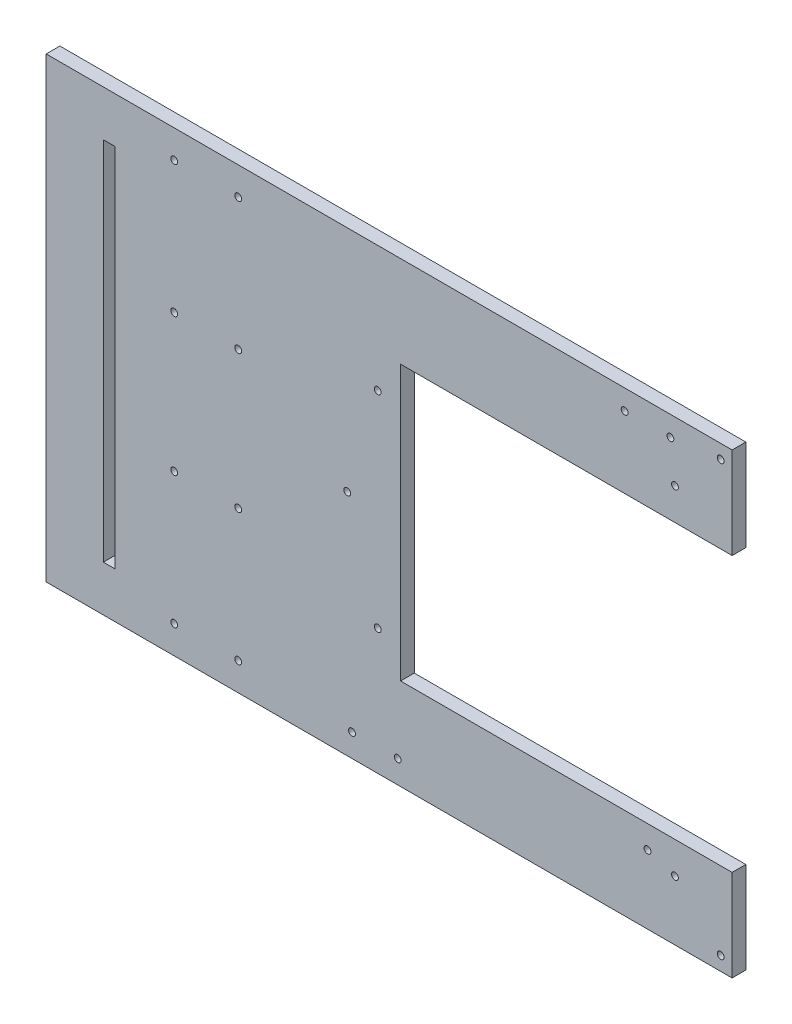
ISO-10303-21;
HEADER;
FILE_DESCRIPTION(('STEP AP214'),'2;1');
FILE_NAME('part.step','',(''),(''),'','','');
FILE_SCHEMA(('AUTOMOTIVE_DESIGN { 1 0 10303 214 1 1 1 1 }'));
ENDSEC;
DATA;
#1=APPLICATION_CONTEXT('core data for automotive mechanical design processes');
#2=APPLICATION_PROTOCOL_DEFINITION('international standard','automotive_design',2000,#1);
#3=PRODUCT_CONTEXT('',#1,'mechanical');
#4=PRODUCT('Part','Part','',(#3));
#5=PRODUCT_RELATED_PRODUCT_CATEGORY('part','',(#4));
#6=PRODUCT_DEFINITION_FORMATION('','',#4);
#7=PRODUCT_DEFINITION_CONTEXT('part definition',#1,'design');
#8=PRODUCT_DEFINITION('design','',#6,#7);
#9=PRODUCT_DEFINITION_SHAPE('','',#8);
#10=(LENGTH_UNIT() NAMED_UNIT(*) SI_UNIT(.MILLI.,.METRE.));
#11=(NAMED_UNIT(*) PLANE_ANGLE_UNIT() SI_UNIT($,.RADIAN.));
#12=(NAMED_UNIT(*) SI_UNIT($,.STERADIAN.) SOLID_ANGLE_UNIT());
#13=UNCERTAINTY_MEASURE_WITH_UNIT(LENGTH_MEASURE(1.E-05),#10,'distance_accuracy_value','');
#14=(GEOMETRIC_REPRESENTATION_CONTEXT(3) GLOBAL_UNCERTAINTY_ASSIGNED_CONTEXT((#13)) GLOBAL_UNIT_ASSIGNED_CONTEXT((#10,
#11,#12)) REPRESENTATION_CONTEXT('',''));
#15=CARTESIAN_POINT('',(0.,0.,0.));
#16=DIRECTION('',(0.,0.,1.));
#17=DIRECTION('',(1.,0.,0.));
#18=AXIS2_PLACEMENT_3D('',#15,#16,#17);
#19=CARTESIAN_POINT('',(0.,0.,6.));
#20=DIRECTION('',(0.,0.,-1.));
#21=DIRECTION('',(-1.,0.,0.));
#22=AXIS2_PLACEMENT_3D('',#19,#20,#21);
#23=PLANE('',#22);
#24=CARTESIAN_POINT('',(262.999999999935,29.9999999999989,6.00000000000001));
#25=DIRECTION('',(0.,0.,1.));
#26=DIRECTION('',(1.,0.,0.));
#27=AXIS2_PLACEMENT_3D('',#24,#25,#26);
#28=CIRCLE('',#27,1.5);
#29=CARTESIAN_POINT('',(264.499999999935,29.9999999999989,6.00000000000001));
#30=VERTEX_POINT('',#29);
#31=EDGE_CURVE('E627',#30,#30,#28,.T.);
#32=ORIENTED_EDGE('',*,*,#31,.F.);
#33=EDGE_LOOP('',(#32));
#34=FACE_BOUND('',#33,.T.);
#35=CARTESIAN_POINT('',(145.,54.9999999999977,6.00000000000001));
#36=DIRECTION('',(0.,0.,1.));
#37=DIRECTION('',(1.,0.,0.));
#38=AXIS2_PLACEMENT_3D('',#35,#36,#37);
#39=CIRCLE('',#38,1.5);
#40=CARTESIAN_POINT('',(146.5,54.9999999999977,6.00000000000001));
#41=VERTEX_POINT('',#40);
#42=EDGE_CURVE('E621',#41,#41,#39,.T.);
#43=ORIENTED_EDGE('',*,*,#42,.F.);
#44=EDGE_LOOP('',(#43));
#45=FACE_BOUND('',#44,.T.);
#46=CARTESIAN_POINT('',(145.,144.999999999998,6.00000000000001));
#47=DIRECTION('',(0.,0.,1.));
#48=DIRECTION('',(1.,0.,0.));
#49=AXIS2_PLACEMENT_3D('',#46,#47,#48);
#50=CIRCLE('',#49,1.5);
#51=CARTESIAN_POINT('',(146.5,144.999999999998,6.00000000000001));
#52=VERTEX_POINT('',#51);
#53=EDGE_CURVE('E615',#52,#52,#50,.T.);
#54=ORIENTED_EDGE('',*,*,#53,.F.);
#55=EDGE_LOOP('',(#54));
#56=FACE_BOUND('',#55,.T.);
#57=CARTESIAN_POINT('',(131.667186687079,99.9999999999989,6.00000000000001));
#58=DIRECTION('',(0.,0.,1.));
#59=DIRECTION('',(1.,0.,0.));
#60=AXIS2_PLACEMENT_3D('',#57,#58,#59);
#61=CIRCLE('',#60,1.5);
#62=CARTESIAN_POINT('',(133.167186687079,99.9999999999989,6.00000000000001));
#63=VERTEX_POINT('',#62);
#64=EDGE_CURVE('E609',#63,#63,#61,.T.);
#65=ORIENTED_EDGE('',*,*,#64,.F.);
#66=EDGE_LOOP('',(#65));
#67=FACE_BOUND('',#66,.T.);
#68=CARTESIAN_POINT('',(252.999999999937,191.262292266871,6.00000000000001));
#69=DIRECTION('',(0.,0.,1.));
#70=DIRECTION('',(1.,0.,0.));
#71=AXIS2_PLACEMENT_3D('',#68,#69,#70);
#72=CIRCLE('',#71,1.5);
#73=CARTESIAN_POINT('',(254.499999999937,191.262292266871,6.00000000000001));
#74=VERTEX_POINT('',#73);
#75=EDGE_CURVE('E603',#74,#74,#72,.T.);
#76=ORIENTED_EDGE('',*,*,#75,.F.);
#77=EDGE_LOOP('',(#76));
#78=FACE_BOUND('',#77,.T.);
#79=CARTESIAN_POINT('',(272.999999999937,191.262292266871,6.00000000000001));
#80=DIRECTION('',(0.,0.,1.));
#81=DIRECTION('',(1.,0.,0.));
#82=AXIS2_PLACEMENT_3D('',#79,#80,#81);
#83=CIRCLE('',#82,1.5);
#84=CARTESIAN_POINT('',(274.499999999937,191.262292266871,6.00000000000001));
#85=VERTEX_POINT('',#84);
#86=EDGE_CURVE('E597',#85,#85,#83,.T.);
#87=ORIENTED_EDGE('',*,*,#86,.F.);
#88=EDGE_LOOP('',(#87));
#89=FACE_BOUND('',#88,.T.);
#90=CARTESIAN_POINT('',(294.999999999998,193.930972909708,6.00000000000001));
#91=DIRECTION('',(0.,0.,1.));
#92=DIRECTION('',(1.,0.,0.));
#93=AXIS2_PLACEMENT_3D('',#90,#91,#92);
#94=CIRCLE('',#93,1.5);
#95=CARTESIAN_POINT('',(296.499999999998,193.930972909708,6.00000000000001));
#96=VERTEX_POINT('',#95);
#97=EDGE_CURVE('E591',#96,#96,#94,.T.);
#98=ORIENTED_EDGE('',*,*,#97,.F.);
#99=EDGE_LOOP('',(#98));
#100=FACE_BOUND('',#99,.T.);
#101=CARTESIAN_POINT('',(274.999999999998,173.930972909708,6.00000000000001));
#102=DIRECTION('',(0.,0.,1.));
#103=DIRECTION('',(1.,0.,0.));
#104=AXIS2_PLACEMENT_3D('',#101,#102,#103);
#105=CIRCLE('',#104,1.5);
#106=CARTESIAN_POINT('',(276.499999999998,173.930972909708,6.00000000000001));
#107=VERTEX_POINT('',#106);
#108=EDGE_CURVE('E585',#107,#107,#105,.T.);
#109=ORIENTED_EDGE('',*,*,#108,.F.);
#110=EDGE_LOOP('',(#109));
#111=FACE_BOUND('',#110,.T.);
#112=CARTESIAN_POINT('',(294.999999999998,6.06902709029225,6.00000000000001));
#113=DIRECTION('',(0.,0.,1.));
#114=DIRECTION('',(1.,0.,0.));
#115=AXIS2_PLACEMENT_3D('',#112,#113,#114);
#116=CIRCLE('',#115,1.5);
#117=CARTESIAN_POINT('',(296.499999999998,6.06902709029225,6.00000000000001));
#118=VERTEX_POINT('',#117);
#119=EDGE_CURVE('E579',#118,#118,#116,.T.);
#120=ORIENTED_EDGE('',*,*,#119,.F.);
#121=EDGE_LOOP('',(#120));
#122=FACE_BOUND('',#121,.T.);
#123=CARTESIAN_POINT('',(274.999999999998,26.069027090292,6.00000000000001));
#124=DIRECTION('',(0.,0.,1.));
#125=DIRECTION('',(1.,0.,0.));
#126=AXIS2_PLACEMENT_3D('',#123,#124,#125);
#127=CIRCLE('',#126,1.5);
#128=CARTESIAN_POINT('',(276.499999999998,26.069027090292,6.00000000000001));
#129=VERTEX_POINT('',#128);
#130=EDGE_CURVE('E573',#129,#129,#127,.T.);
#131=ORIENTED_EDGE('',*,*,#130,.F.);
#132=EDGE_LOOP('',(#131));
#133=FACE_BOUND('',#132,.T.);
#134=CARTESIAN_POINT('',(133.760758533531,10.0000000000011,6.00000000000001));
#135=DIRECTION('',(0.,0.,1.));
#136=DIRECTION('',(1.,0.,0.));
#137=AXIS2_PLACEMENT_3D('',#134,#135,#136);
#138=CIRCLE('',#137,1.5);
#139=CARTESIAN_POINT('',(135.260758533531,10.0000000000011,6.00000000000001));
#140=VERTEX_POINT('',#139);
#141=EDGE_CURVE('E561',#140,#140,#138,.T.);
#142=ORIENTED_EDGE('',*,*,#141,.F.);
#143=EDGE_LOOP('',(#142));
#144=FACE_BOUND('',#143,.T.);
#145=CARTESIAN_POINT('',(84.0000000005229,69.9014541805839,6.00000000000001));
#146=DIRECTION('',(0.,0.,1.));
#147=DIRECTION('',(1.,0.,0.));
#148=AXIS2_PLACEMENT_3D('',#145,#146,#147);
#149=CIRCLE('',#148,1.49999999999999);
#150=CARTESIAN_POINT('',(85.5000000005229,69.9014541805839,6.00000000000001));
#151=VERTEX_POINT('',#150);
#152=EDGE_CURVE('E555',#151,#151,#149,.T.);
#153=ORIENTED_EDGE('',*,*,#152,.F.);
#154=EDGE_LOOP('',(#153));
#155=FACE_BOUND('',#154,.T.);
#156=CARTESIAN_POINT('',(56.0000000005229,69.9014541805842,6.00000000000001));
#157=DIRECTION('',(0.,0.,1.));
#158=DIRECTION('',(1.,0.,0.));
#159=AXIS2_PLACEMENT_3D('',#156,#157,#158);
#160=CIRCLE('',#159,1.49999999999999);
#161=CARTESIAN_POINT('',(57.5000000005229,69.9014541805842,6.00000000000001));
#162=VERTEX_POINT('',#161);
#163=EDGE_CURVE('E549',#162,#162,#160,.T.);
#164=ORIENTED_EDGE('',*,*,#163,.F.);
#165=EDGE_LOOP('',(#164));
#166=FACE_BOUND('',#165,.T.);
#167=CARTESIAN_POINT('',(84.0000000005223,12.2365999999972,6.00000000000001));
#168=DIRECTION('',(0.,0.,1.));
#169=DIRECTION('',(1.,0.,0.));
#170=AXIS2_PLACEMENT_3D('',#167,#168,#169);
#171=CIRCLE('',#170,1.49999999999999);
#172=CARTESIAN_POINT('',(85.5000000005223,12.2365999999972,6.00000000000001));
#173=VERTEX_POINT('',#172);
#174=EDGE_CURVE('E543',#173,#173,#171,.T.);
#175=ORIENTED_EDGE('',*,*,#174,.F.);
#176=EDGE_LOOP('',(#175));
#177=FACE_BOUND('',#176,.T.);
#178=CARTESIAN_POINT('',(56.0000000005223,12.2365999999975,6.00000000000001));
#179=DIRECTION('',(0.,0.,1.));
#180=DIRECTION('',(1.,0.,0.));
#181=AXIS2_PLACEMENT_3D('',#178,#179,#180);
#182=CIRCLE('',#181,1.49999999999999);
#183=CARTESIAN_POINT('',(57.5000000005223,12.2365999999975,6.00000000000001));
#184=VERTEX_POINT('',#183);
#185=EDGE_CURVE('E537',#184,#184,#182,.T.);
#186=ORIENTED_EDGE('',*,*,#185,.F.);
#187=EDGE_LOOP('',(#186));
#188=FACE_BOUND('',#187,.T.);
#189=CARTESIAN_POINT('',(84.000000000509,130.098545819415,6.00000000000001));
#190=DIRECTION('',(0.,0.,1.));
#191=DIRECTION('',(1.,0.,0.));
#192=AXIS2_PLACEMENT_3D('',#189,#190,#191);
#193=CIRCLE('',#192,1.49999999999999);
#194=CARTESIAN_POINT('',(85.500000000509,130.098545819415,6.00000000000001));
#195=VERTEX_POINT('',#194);
#196=EDGE_CURVE('E531',#195,#195,#193,.T.);
#197=ORIENTED_EDGE('',*,*,#196,.F.);
#198=EDGE_LOOP('',(#197));
#199=FACE_BOUND('',#198,.T.);
#200=CARTESIAN_POINT('',(56.000000000509,130.098545819415,6.00000000000001));
#201=DIRECTION('',(0.,0.,1.));
#202=DIRECTION('',(1.,0.,0.));
#203=AXIS2_PLACEMENT_3D('',#200,#201,#202);
#204=CIRCLE('',#203,1.49999999999999);
#205=CARTESIAN_POINT('',(57.500000000509,130.098545819415,6.00000000000001));
#206=VERTEX_POINT('',#205);
#207=EDGE_CURVE('E525',#206,#206,#204,.T.);
#208=ORIENTED_EDGE('',*,*,#207,.F.);
#209=EDGE_LOOP('',(#208));
#210=FACE_BOUND('',#209,.T.);
#211=CARTESIAN_POINT('',(84.0000000005085,187.763400000002,6.00000000000001));
#212=DIRECTION('',(0.,0.,1.));
#213=DIRECTION('',(1.,0.,0.));
#214=AXIS2_PLACEMENT_3D('',#211,#212,#213);
#215=CIRCLE('',#214,1.49999999999999);
#216=CARTESIAN_POINT('',(85.5000000005084,187.763400000002,6.00000000000001));
#217=VERTEX_POINT('',#216);
#218=EDGE_CURVE('E519',#217,#217,#215,.T.);
#219=ORIENTED_EDGE('',*,*,#218,.F.);
#220=EDGE_LOOP('',(#219));
#221=FACE_BOUND('',#220,.T.);
#222=CARTESIAN_POINT('',(56.0000000005084,187.763400000002,6.00000000000001));
#223=DIRECTION('',(0.,0.,1.));
#224=DIRECTION('',(1.,0.,0.));
#225=AXIS2_PLACEMENT_3D('',#222,#223,#224);
#226=CIRCLE('',#225,1.49999999999999);
#227=CARTESIAN_POINT('',(57.5000000005084,187.763400000002,6.00000000000001));
#228=VERTEX_POINT('',#227);
#229=EDGE_CURVE('E513',#228,#228,#226,.T.);
#230=ORIENTED_EDGE('',*,*,#229,.F.);
#231=EDGE_LOOP('',(#230));
#232=FACE_BOUND('',#231,.T.);
#233=DIRECTION('',(1.,0.,0.));
#234=VECTOR('',#233,1.);
#235=CARTESIAN_POINT('',(300.,160.,6.00000000000001));
#236=LINE('',#235,#234);
#237=CARTESIAN_POINT('',(155.,160.,6.00000000000001));
#238=VERTEX_POINT('',#237);
#239=CARTESIAN_POINT('',(300.,160.,6.00000000000001));
#240=VERTEX_POINT('',#239);
#241=EDGE_CURVE('E159',#238,#240,#236,.T.);
#242=ORIENTED_EDGE('',*,*,#241,.T.);
#243=DIRECTION('',(0.,1.,0.));
#244=VECTOR('',#243,1.);
#245=CARTESIAN_POINT('',(300.,0.,6.));
#246=LINE('',#245,#244);
#247=CARTESIAN_POINT('',(300.,200.,6.));
#248=VERTEX_POINT('',#247);
#249=EDGE_CURVE('E190',#240,#248,#246,.T.);
#250=ORIENTED_EDGE('',*,*,#249,.T.);
#251=DIRECTION('',(-1.,0.,0.));
#252=VECTOR('',#251,1.);
#253=CARTESIAN_POINT('',(0.,200.,6.));
#254=LINE('',#253,#252);
#255=CARTESIAN_POINT('',(0.,200.,6.));
#256=VERTEX_POINT('',#255);
#257=EDGE_CURVE('E194',#248,#256,#254,.T.);
#258=ORIENTED_EDGE('',*,*,#257,.T.);
#259=DIRECTION('',(0.,-1.,0.));
#260=VECTOR('',#259,1.);
#261=CARTESIAN_POINT('',(0.,0.,6.));
#262=LINE('',#261,#260);
#263=CARTESIAN_POINT('',(0.,0.,6.));
#264=VERTEX_POINT('',#263);
#265=EDGE_CURVE('E184',#256,#264,#262,.T.);
#266=ORIENTED_EDGE('',*,*,#265,.T.);
#267=DIRECTION('',(1.,0.,0.));
#268=VECTOR('',#267,1.);
#269=CARTESIAN_POINT('',(0.,0.,6.));
#270=LINE('',#269,#268);
#271=CARTESIAN_POINT('',(300.,0.,6.));
#272=VERTEX_POINT('',#271);
#273=EDGE_CURVE('E187',#264,#272,#270,.T.);
#274=ORIENTED_EDGE('',*,*,#273,.T.);
#275=CARTESIAN_POINT('',(300.,40.,6.00000000000001));
#276=VERTEX_POINT('',#275);
#277=EDGE_CURVE('E191',#272,#276,#246,.T.);
#278=ORIENTED_EDGE('',*,*,#277,.T.);
#279=DIRECTION('',(1.,0.,0.));
#280=VECTOR('',#279,1.);
#281=CARTESIAN_POINT('',(300.,40.,6.00000000000001));
#282=LINE('',#281,#280);
#283=CARTESIAN_POINT('',(155.,40.,6.00000000000001));
#284=VERTEX_POINT('',#283);
#285=EDGE_CURVE('E163',#284,#276,#282,.T.);
#286=ORIENTED_EDGE('',*,*,#285,.F.);
#287=DIRECTION('',(0.,1.,0.));
#288=VECTOR('',#287,1.);
#289=CARTESIAN_POINT('',(155.,160.,6.00000000000001));
#290=LINE('',#289,#288);
#291=EDGE_CURVE('E156',#284,#238,#290,.T.);
#292=ORIENTED_EDGE('',*,*,#291,.T.);
#293=EDGE_LOOP('',(#242,#250,#258,#266,#274,#278,#286,#292));
#294=FACE_BOUND('',#293,.T.);
#295=DIRECTION('',(1.,0.,0.));
#296=VECTOR('',#295,1.);
#297=CARTESIAN_POINT('',(25.,180.,6.00000000000001));
#298=LINE('',#297,#296);
#299=CARTESIAN_POINT('',(25.,180.,6.));
#300=VERTEX_POINT('',#299);
#301=CARTESIAN_POINT('',(30.,180.,6.00000000000001));
#302=VERTEX_POINT('',#301);
#303=EDGE_CURVE('E152',#300,#302,#298,.T.);
#304=ORIENTED_EDGE('',*,*,#303,.T.);
#305=DIRECTION('',(0.,-1.,0.));
#306=VECTOR('',#305,1.);
#307=CARTESIAN_POINT('',(30.,180.,6.00000000000001));
#308=LINE('',#307,#306);
#309=CARTESIAN_POINT('',(30.,20.,6.00000000000001));
#310=VERTEX_POINT('',#309);
#311=EDGE_CURVE('E155',#302,#310,#308,.T.);
#312=ORIENTED_EDGE('',*,*,#311,.T.);
#313=DIRECTION('',(-1.,0.,0.));
#314=VECTOR('',#313,1.);
#315=CARTESIAN_POINT('',(25.,20.,6.00000000000001));
#316=LINE('',#315,#314);
#317=CARTESIAN_POINT('',(25.,20.,6.00000000000001));
#318=VERTEX_POINT('',#317);
#319=EDGE_CURVE('E125',#310,#318,#316,.T.);
#320=ORIENTED_EDGE('',*,*,#319,.T.);
#321=DIRECTION('',(0.,1.,0.));
#322=VECTOR('',#321,1.);
#323=CARTESIAN_POINT('',(25.,180.,6.00000000000001));
#324=LINE('',#323,#322);
#325=EDGE_CURVE('E168',#318,#300,#324,.T.);
#326=ORIENTED_EDGE('',*,*,#325,.T.);
#327=EDGE_LOOP('',(#304,#312,#320,#326));
#328=FACE_BOUND('',#327,.T.);
#329=CARTESIAN_POINT('',(153.760758533531,10.0000000000013,6.00000000000001));
#330=DIRECTION('',(0.,0.,1.));
#331=DIRECTION('',(1.,0.,0.));
#332=AXIS2_PLACEMENT_3D('',#329,#330,#331);
#333=CIRCLE('',#332,1.5);
#334=CARTESIAN_POINT('',(155.260758533531,10.0000000000013,6.00000000000001));
#335=VERTEX_POINT('',#334);
#336=EDGE_CURVE('E567',#335,#335,#333,.T.);
#337=ORIENTED_EDGE('',*,*,#336,.F.);
#338=EDGE_LOOP('',(#337));
#339=FACE_BOUND('',#338,.T.);
#340=ADVANCED_FACE('F33',(#34,#45,#56,#67,#78,#89,#100,#111,#122,#133,#144,#155,#166,#177,#188,
#199,#210,#221,#232,#294,#328,#339),#23,.F.);
#341=CARTESIAN_POINT('',(0.,0.,0.));
#342=DIRECTION('',(0.,0.,-1.));
#343=DIRECTION('',(-1.,0.,0.));
#344=AXIS2_PLACEMENT_3D('',#341,#342,#343);
#345=PLANE('',#344);
#346=CARTESIAN_POINT('',(262.999999999935,29.9999999999989,0.));
#347=DIRECTION('',(0.,0.,1.));
#348=DIRECTION('',(1.,0.,0.));
#349=AXIS2_PLACEMENT_3D('',#346,#347,#348);
#350=CIRCLE('',#349,1.5);
#351=CARTESIAN_POINT('',(264.499999999935,29.9999999999989,0.));
#352=VERTEX_POINT('',#351);
#353=EDGE_CURVE('E624',#352,#352,#350,.T.);
#354=ORIENTED_EDGE('',*,*,#353,.T.);
#355=EDGE_LOOP('',(#354));
#356=FACE_BOUND('',#355,.T.);
#357=CARTESIAN_POINT('',(145.,54.9999999999977,0.));
#358=DIRECTION('',(0.,0.,1.));
#359=DIRECTION('',(1.,0.,0.));
#360=AXIS2_PLACEMENT_3D('',#357,#358,#359);
#361=CIRCLE('',#360,1.5);
#362=CARTESIAN_POINT('',(146.5,54.9999999999977,0.));
#363=VERTEX_POINT('',#362);
#364=EDGE_CURVE('E618',#363,#363,#361,.T.);
#365=ORIENTED_EDGE('',*,*,#364,.T.);
#366=EDGE_LOOP('',(#365));
#367=FACE_BOUND('',#366,.T.);
#368=CARTESIAN_POINT('',(145.,144.999999999998,0.));
#369=DIRECTION('',(0.,0.,1.));
#370=DIRECTION('',(1.,0.,0.));
#371=AXIS2_PLACEMENT_3D('',#368,#369,#370);
#372=CIRCLE('',#371,1.5);
#373=CARTESIAN_POINT('',(146.5,144.999999999998,0.));
#374=VERTEX_POINT('',#373);
#375=EDGE_CURVE('E612',#374,#374,#372,.T.);
#376=ORIENTED_EDGE('',*,*,#375,.T.);
#377=EDGE_LOOP('',(#376));
#378=FACE_BOUND('',#377,.T.);
#379=CARTESIAN_POINT('',(131.667186687079,99.9999999999989,0.));
#380=DIRECTION('',(0.,0.,1.));
#381=DIRECTION('',(1.,0.,0.));
#382=AXIS2_PLACEMENT_3D('',#379,#380,#381);
#383=CIRCLE('',#382,1.5);
#384=CARTESIAN_POINT('',(133.167186687079,99.9999999999989,0.));
#385=VERTEX_POINT('',#384);
#386=EDGE_CURVE('E606',#385,#385,#383,.T.);
#387=ORIENTED_EDGE('',*,*,#386,.T.);
#388=EDGE_LOOP('',(#387));
#389=FACE_BOUND('',#388,.T.);
#390=CARTESIAN_POINT('',(252.999999999937,191.262292266871,0.));
#391=DIRECTION('',(0.,0.,1.));
#392=DIRECTION('',(1.,0.,0.));
#393=AXIS2_PLACEMENT_3D('',#390,#391,#392);
#394=CIRCLE('',#393,1.5);
#395=CARTESIAN_POINT('',(254.499999999937,191.262292266871,0.));
#396=VERTEX_POINT('',#395);
#397=EDGE_CURVE('E600',#396,#396,#394,.T.);
#398=ORIENTED_EDGE('',*,*,#397,.T.);
#399=EDGE_LOOP('',(#398));
#400=FACE_BOUND('',#399,.T.);
#401=CARTESIAN_POINT('',(272.999999999937,191.262292266871,0.));
#402=DIRECTION('',(0.,0.,1.));
#403=DIRECTION('',(1.,0.,0.));
#404=AXIS2_PLACEMENT_3D('',#401,#402,#403);
#405=CIRCLE('',#404,1.5);
#406=CARTESIAN_POINT('',(274.499999999937,191.262292266871,0.));
#407=VERTEX_POINT('',#406);
#408=EDGE_CURVE('E594',#407,#407,#405,.T.);
#409=ORIENTED_EDGE('',*,*,#408,.T.);
#410=EDGE_LOOP('',(#409));
#411=FACE_BOUND('',#410,.T.);
#412=CARTESIAN_POINT('',(294.999999999998,193.930972909708,0.));
#413=DIRECTION('',(0.,0.,1.));
#414=DIRECTION('',(1.,0.,0.));
#415=AXIS2_PLACEMENT_3D('',#412,#413,#414);
#416=CIRCLE('',#415,1.5);
#417=CARTESIAN_POINT('',(296.499999999998,193.930972909708,0.));
#418=VERTEX_POINT('',#417);
#419=EDGE_CURVE('E588',#418,#418,#416,.T.);
#420=ORIENTED_EDGE('',*,*,#419,.T.);
#421=EDGE_LOOP('',(#420));
#422=FACE_BOUND('',#421,.T.);
#423=CARTESIAN_POINT('',(274.999999999998,173.930972909708,0.));
#424=DIRECTION('',(0.,0.,1.));
#425=DIRECTION('',(1.,0.,0.));
#426=AXIS2_PLACEMENT_3D('',#423,#424,#425);
#427=CIRCLE('',#426,1.5);
#428=CARTESIAN_POINT('',(276.499999999998,173.930972909708,0.));
#429=VERTEX_POINT('',#428);
#430=EDGE_CURVE('E582',#429,#429,#427,.T.);
#431=ORIENTED_EDGE('',*,*,#430,.T.);
#432=EDGE_LOOP('',(#431));
#433=FACE_BOUND('',#432,.T.);
#434=CARTESIAN_POINT('',(294.999999999998,6.06902709029225,0.));
#435=DIRECTION('',(0.,0.,1.));
#436=DIRECTION('',(1.,0.,0.));
#437=AXIS2_PLACEMENT_3D('',#434,#435,#436);
#438=CIRCLE('',#437,1.5);
#439=CARTESIAN_POINT('',(296.499999999998,6.06902709029225,0.));
#440=VERTEX_POINT('',#439);
#441=EDGE_CURVE('E576',#440,#440,#438,.T.);
#442=ORIENTED_EDGE('',*,*,#441,.T.);
#443=EDGE_LOOP('',(#442));
#444=FACE_BOUND('',#443,.T.);
#445=CARTESIAN_POINT('',(274.999999999998,26.069027090292,0.));
#446=DIRECTION('',(0.,0.,1.));
#447=DIRECTION('',(1.,0.,0.));
#448=AXIS2_PLACEMENT_3D('',#445,#446,#447);
#449=CIRCLE('',#448,1.5);
#450=CARTESIAN_POINT('',(276.499999999998,26.069027090292,0.));
#451=VERTEX_POINT('',#450);
#452=EDGE_CURVE('E570',#451,#451,#449,.T.);
#453=ORIENTED_EDGE('',*,*,#452,.T.);
#454=EDGE_LOOP('',(#453));
#455=FACE_BOUND('',#454,.T.);
#456=CARTESIAN_POINT('',(153.760758533531,10.0000000000013,0.));
#457=DIRECTION('',(0.,0.,1.));
#458=DIRECTION('',(1.,0.,0.));
#459=AXIS2_PLACEMENT_3D('',#456,#457,#458);
#460=CIRCLE('',#459,1.5);
#461=CARTESIAN_POINT('',(155.260758533531,10.0000000000013,0.));
#462=VERTEX_POINT('',#461);
#463=EDGE_CURVE('E564',#462,#462,#460,.T.);
#464=ORIENTED_EDGE('',*,*,#463,.T.);
#465=EDGE_LOOP('',(#464));
#466=FACE_BOUND('',#465,.T.);
#467=CARTESIAN_POINT('',(133.760758533531,10.0000000000011,0.));
#468=DIRECTION('',(0.,0.,1.));
#469=DIRECTION('',(1.,0.,0.));
#470=AXIS2_PLACEMENT_3D('',#467,#468,#469);
#471=CIRCLE('',#470,1.5);
#472=CARTESIAN_POINT('',(135.260758533531,10.0000000000011,0.));
#473=VERTEX_POINT('',#472);
#474=EDGE_CURVE('E558',#473,#473,#471,.T.);
#475=ORIENTED_EDGE('',*,*,#474,.T.);
#476=EDGE_LOOP('',(#475));
#477=FACE_BOUND('',#476,.T.);
#478=CARTESIAN_POINT('',(84.0000000005229,69.9014541805839,0.));
#479=DIRECTION('',(0.,0.,1.));
#480=DIRECTION('',(1.,0.,0.));
#481=AXIS2_PLACEMENT_3D('',#478,#479,#480);
#482=CIRCLE('',#481,1.5);
#483=CARTESIAN_POINT('',(85.5000000005229,69.9014541805839,0.));
#484=VERTEX_POINT('',#483);
#485=EDGE_CURVE('E552',#484,#484,#482,.T.);
#486=ORIENTED_EDGE('',*,*,#485,.T.);
#487=EDGE_LOOP('',(#486));
#488=FACE_BOUND('',#487,.T.);
#489=CARTESIAN_POINT('',(56.0000000005229,69.9014541805842,0.));
#490=DIRECTION('',(0.,0.,1.));
#491=DIRECTION('',(1.,0.,0.));
#492=AXIS2_PLACEMENT_3D('',#489,#490,#491);
#493=CIRCLE('',#492,1.5);
#494=CARTESIAN_POINT('',(57.5000000005229,69.9014541805842,0.));
#495=VERTEX_POINT('',#494);
#496=EDGE_CURVE('E546',#495,#495,#493,.T.);
#497=ORIENTED_EDGE('',*,*,#496,.T.);
#498=EDGE_LOOP('',(#497));
#499=FACE_BOUND('',#498,.T.);
#500=CARTESIAN_POINT('',(84.0000000005223,12.2365999999972,0.));
#501=DIRECTION('',(0.,0.,1.));
#502=DIRECTION('',(1.,0.,0.));
#503=AXIS2_PLACEMENT_3D('',#500,#501,#502);
#504=CIRCLE('',#503,1.5);
#505=CARTESIAN_POINT('',(85.5000000005223,12.2365999999972,0.));
#506=VERTEX_POINT('',#505);
#507=EDGE_CURVE('E540',#506,#506,#504,.T.);
#508=ORIENTED_EDGE('',*,*,#507,.T.);
#509=EDGE_LOOP('',(#508));
#510=FACE_BOUND('',#509,.T.);
#511=CARTESIAN_POINT('',(56.0000000005223,12.2365999999975,0.));
#512=DIRECTION('',(0.,0.,1.));
#513=DIRECTION('',(1.,0.,0.));
#514=AXIS2_PLACEMENT_3D('',#511,#512,#513);
#515=CIRCLE('',#514,1.5);
#516=CARTESIAN_POINT('',(57.5000000005223,12.2365999999975,0.));
#517=VERTEX_POINT('',#516);
#518=EDGE_CURVE('E534',#517,#517,#515,.T.);
#519=ORIENTED_EDGE('',*,*,#518,.T.);
#520=EDGE_LOOP('',(#519));
#521=FACE_BOUND('',#520,.T.);
#522=CARTESIAN_POINT('',(84.000000000509,130.098545819415,0.));
#523=DIRECTION('',(0.,0.,1.));
#524=DIRECTION('',(1.,0.,0.));
#525=AXIS2_PLACEMENT_3D('',#522,#523,#524);
#526=CIRCLE('',#525,1.5);
#527=CARTESIAN_POINT('',(85.500000000509,130.098545819415,0.));
#528=VERTEX_POINT('',#527);
#529=EDGE_CURVE('E528',#528,#528,#526,.T.);
#530=ORIENTED_EDGE('',*,*,#529,.T.);
#531=EDGE_LOOP('',(#530));
#532=FACE_BOUND('',#531,.T.);
#533=CARTESIAN_POINT('',(56.000000000509,130.098545819415,0.));
#534=DIRECTION('',(0.,0.,1.));
#535=DIRECTION('',(1.,0.,0.));
#536=AXIS2_PLACEMENT_3D('',#533,#534,#535);
#537=CIRCLE('',#536,1.5);
#538=CARTESIAN_POINT('',(57.500000000509,130.098545819415,0.));
#539=VERTEX_POINT('',#538);
#540=EDGE_CURVE('E522',#539,#539,#537,.T.);
#541=ORIENTED_EDGE('',*,*,#540,.T.);
#542=EDGE_LOOP('',(#541));
#543=FACE_BOUND('',#542,.T.);
#544=CARTESIAN_POINT('',(84.0000000005085,187.763400000002,0.));
#545=DIRECTION('',(0.,0.,1.));
#546=DIRECTION('',(1.,0.,0.));
#547=AXIS2_PLACEMENT_3D('',#544,#545,#546);
#548=CIRCLE('',#547,1.5);
#549=CARTESIAN_POINT('',(85.5000000005085,187.763400000002,0.));
#550=VERTEX_POINT('',#549);
#551=EDGE_CURVE('E516',#550,#550,#548,.T.);
#552=ORIENTED_EDGE('',*,*,#551,.T.);
#553=EDGE_LOOP('',(#552));
#554=FACE_BOUND('',#553,.T.);
#555=CARTESIAN_POINT('',(56.0000000005084,187.763400000002,0.));
#556=DIRECTION('',(0.,0.,1.));
#557=DIRECTION('',(1.,0.,0.));
#558=AXIS2_PLACEMENT_3D('',#555,#556,#557);
#559=CIRCLE('',#558,1.5);
#560=CARTESIAN_POINT('',(57.5000000005084,187.763400000002,0.));
#561=VERTEX_POINT('',#560);
#562=EDGE_CURVE('E144',#561,#561,#559,.T.);
#563=ORIENTED_EDGE('',*,*,#562,.T.);
#564=EDGE_LOOP('',(#563));
#565=FACE_BOUND('',#564,.T.);
#566=DIRECTION('',(0.,1.,0.));
#567=VECTOR('',#566,1.);
#568=CARTESIAN_POINT('',(300.,0.,0.));
#569=LINE('',#568,#567);
#570=CARTESIAN_POINT('',(300.,160.,0.));
#571=VERTEX_POINT('',#570);
#572=CARTESIAN_POINT('',(300.,200.,0.));
#573=VERTEX_POINT('',#572);
#574=EDGE_CURVE('E201',#571,#573,#569,.T.);
#575=ORIENTED_EDGE('',*,*,#574,.F.);
#576=DIRECTION('',(-1.,0.,0.));
#577=VECTOR('',#576,1.);
#578=CARTESIAN_POINT('',(300.,160.,0.));
#579=LINE('',#578,#577);
#580=CARTESIAN_POINT('',(155.,160.,0.));
#581=VERTEX_POINT('',#580);
#582=EDGE_CURVE('E171',#571,#581,#579,.T.);
#583=ORIENTED_EDGE('',*,*,#582,.T.);
#584=DIRECTION('',(0.,-1.,0.));
#585=VECTOR('',#584,1.);
#586=CARTESIAN_POINT('',(155.,160.,0.));
#587=LINE('',#586,#585);
#588=CARTESIAN_POINT('',(155.,40.,0.));
#589=VERTEX_POINT('',#588);
#590=EDGE_CURVE('E167',#581,#589,#587,.T.);
#591=ORIENTED_EDGE('',*,*,#590,.T.);
#592=DIRECTION('',(-1.,0.,0.));
#593=VECTOR('',#592,1.);
#594=CARTESIAN_POINT('',(300.,40.,0.));
#595=LINE('',#594,#593);
#596=CARTESIAN_POINT('',(300.,40.,0.));
#597=VERTEX_POINT('',#596);
#598=EDGE_CURVE('E164',#597,#589,#595,.T.);
#599=ORIENTED_EDGE('',*,*,#598,.F.);
#600=CARTESIAN_POINT('',(300.,0.,0.));
#601=VERTEX_POINT('',#600);
#602=EDGE_CURVE('E202',#601,#597,#569,.T.);
#603=ORIENTED_EDGE('',*,*,#602,.F.);
#604=DIRECTION('',(1.,0.,0.));
#605=VECTOR('',#604,1.);
#606=CARTESIAN_POINT('',(0.,0.,0.));
#607=LINE('',#606,#605);
#608=CARTESIAN_POINT('',(0.,0.,0.));
#609=VERTEX_POINT('',#608);
#610=EDGE_CURVE('E199',#609,#601,#607,.T.);
#611=ORIENTED_EDGE('',*,*,#610,.F.);
#612=DIRECTION('',(0.,-1.,0.));
#613=VECTOR('',#612,1.);
#614=CARTESIAN_POINT('',(0.,0.,0.));
#615=LINE('',#614,#613);
#616=CARTESIAN_POINT('',(0.,200.,0.));
#617=VERTEX_POINT('',#616);
#618=EDGE_CURVE('E183',#617,#609,#615,.T.);
#619=ORIENTED_EDGE('',*,*,#618,.F.);
#620=DIRECTION('',(-1.,0.,0.));
#621=VECTOR('',#620,1.);
#622=CARTESIAN_POINT('',(0.,200.,0.));
#623=LINE('',#622,#621);
#624=EDGE_CURVE('E188',#573,#617,#623,.T.);
#625=ORIENTED_EDGE('',*,*,#624,.F.);
#626=EDGE_LOOP('',(#575,#583,#591,#599,#603,#611,#619,#625));
#627=FACE_BOUND('',#626,.T.);
#628=DIRECTION('',(0.,1.,0.));
#629=VECTOR('',#628,1.);
#630=CARTESIAN_POINT('',(30.,180.,0.));
#631=LINE('',#630,#629);
#632=CARTESIAN_POINT('',(30.,20.,0.));
#633=VERTEX_POINT('',#632);
#634=CARTESIAN_POINT('',(30.,180.,0.));
#635=VERTEX_POINT('',#634);
#636=EDGE_CURVE('E132',#633,#635,#631,.T.);
#637=ORIENTED_EDGE('',*,*,#636,.T.);
#638=DIRECTION('',(-1.,0.,0.));
#639=VECTOR('',#638,1.);
#640=CARTESIAN_POINT('',(25.,180.,0.));
#641=LINE('',#640,#639);
#642=CARTESIAN_POINT('',(25.,180.,0.));
#643=VERTEX_POINT('',#642);
#644=EDGE_CURVE('E138',#635,#643,#641,.T.);
#645=ORIENTED_EDGE('',*,*,#644,.T.);
#646=DIRECTION('',(0.,-1.,0.));
#647=VECTOR('',#646,1.);
#648=CARTESIAN_POINT('',(25.,180.,0.));
#649=LINE('',#648,#647);
#650=CARTESIAN_POINT('',(25.,20.,0.));
#651=VERTEX_POINT('',#650);
#652=EDGE_CURVE('E142',#643,#651,#649,.T.);
#653=ORIENTED_EDGE('',*,*,#652,.T.);
#654=DIRECTION('',(1.,0.,0.));
#655=VECTOR('',#654,1.);
#656=CARTESIAN_POINT('',(25.,20.,0.));
#657=LINE('',#656,#655);
#658=EDGE_CURVE('E56',#651,#633,#657,.T.);
#659=ORIENTED_EDGE('',*,*,#658,.T.);
#660=EDGE_LOOP('',(#637,#645,#653,#659));
#661=FACE_BOUND('',#660,.T.);
#662=ADVANCED_FACE('F141',(#356,#367,#378,#389,#400,#411,#422,#433,#444,#455,#466,#477,#488,
#499,#510,#521,#532,#543,#554,#565,#627,#661),#345,.T.);
#663=CARTESIAN_POINT('',(300.,0.,6.));
#664=DIRECTION('',(-1.,0.,0.));
#665=DIRECTION('',(0.,0.,1.));
#666=AXIS2_PLACEMENT_3D('',#663,#664,#665);
#667=PLANE('',#666);
#668=DIRECTION('',(0.,0.,-1.));
#669=VECTOR('',#668,1.);
#670=CARTESIAN_POINT('',(300.,160.,194.215302247187));
#671=LINE('',#670,#669);
#672=EDGE_CURVE('E160',#240,#571,#671,.T.);
#673=ORIENTED_EDGE('',*,*,#672,.T.);
#674=ORIENTED_EDGE('',*,*,#574,.T.);
#675=DIRECTION('',(0.,0.,-1.));
#676=VECTOR('',#675,1.);
#677=CARTESIAN_POINT('',(300.,200.,6.));
#678=LINE('',#677,#676);
#679=EDGE_CURVE('E208',#248,#573,#678,.T.);
#680=ORIENTED_EDGE('',*,*,#679,.F.);
#681=ORIENTED_EDGE('',*,*,#249,.F.);
#682=EDGE_LOOP('',(#673,#674,#680,#681));
#683=FACE_BOUND('',#682,.T.);
#684=ADVANCED_FACE('F241',(#683),#667,.F.);
#685=CARTESIAN_POINT('',(0.,0.,6.));
#686=DIRECTION('',(1.,0.,0.));
#687=DIRECTION('',(0.,0.,-1.));
#688=AXIS2_PLACEMENT_3D('',#685,#686,#687);
#689=PLANE('',#688);
#690=ORIENTED_EDGE('',*,*,#618,.T.);
#691=DIRECTION('',(0.,0.,-1.));
#692=VECTOR('',#691,1.);
#693=CARTESIAN_POINT('',(0.,0.,6.));
#694=LINE('',#693,#692);
#695=EDGE_CURVE('E11',#264,#609,#694,.T.);
#696=ORIENTED_EDGE('',*,*,#695,.F.);
#697=ORIENTED_EDGE('',*,*,#265,.F.);
#698=DIRECTION('',(0.,0.,-1.));
#699=VECTOR('',#698,1.);
#700=CARTESIAN_POINT('',(0.,200.,6.));
#701=LINE('',#700,#699);
#702=EDGE_CURVE('E196',#256,#617,#701,.T.);
#703=ORIENTED_EDGE('',*,*,#702,.T.);
#704=EDGE_LOOP('',(#690,#696,#697,#703));
#705=FACE_BOUND('',#704,.T.);
#706=ADVANCED_FACE('F35',(#705),#689,.F.);
#707=CARTESIAN_POINT('',(0.,0.,6.));
#708=DIRECTION('',(0.,1.,0.));
#709=DIRECTION('',(0.,0.,1.));
#710=AXIS2_PLACEMENT_3D('',#707,#708,#709);
#711=PLANE('',#710);
#712=ORIENTED_EDGE('',*,*,#610,.T.);
#713=DIRECTION('',(0.,0.,-1.));
#714=VECTOR('',#713,1.);
#715=CARTESIAN_POINT('',(300.,0.,6.));
#716=LINE('',#715,#714);
#717=EDGE_CURVE('E41',#272,#601,#716,.T.);
#718=ORIENTED_EDGE('',*,*,#717,.F.);
#719=ORIENTED_EDGE('',*,*,#273,.F.);
#720=ORIENTED_EDGE('',*,*,#695,.T.);
#721=EDGE_LOOP('',(#712,#718,#719,#720));
#722=FACE_BOUND('',#721,.T.);
#723=ADVANCED_FACE('F231',(#722),#711,.F.);
#724=ORIENTED_EDGE('',*,*,#602,.T.);
#725=DIRECTION('',(0.,0.,-1.));
#726=VECTOR('',#725,1.);
#727=CARTESIAN_POINT('',(300.,40.,194.215302247187));
#728=LINE('',#727,#726);
#729=EDGE_CURVE('E174',#276,#597,#728,.T.);
#730=ORIENTED_EDGE('',*,*,#729,.F.);
#731=ORIENTED_EDGE('',*,*,#277,.F.);
#732=ORIENTED_EDGE('',*,*,#717,.T.);
#733=EDGE_LOOP('',(#724,#730,#731,#732));
#734=FACE_BOUND('',#733,.T.);
#735=ADVANCED_FACE('F215',(#734),#667,.F.);
#736=CARTESIAN_POINT('',(0.,200.,6.));
#737=DIRECTION('',(0.,-1.,0.));
#738=DIRECTION('',(0.,0.,-1.));
#739=AXIS2_PLACEMENT_3D('',#736,#737,#738);
#740=PLANE('',#739);
#741=ORIENTED_EDGE('',*,*,#624,.T.);
#742=ORIENTED_EDGE('',*,*,#702,.F.);
#743=ORIENTED_EDGE('',*,*,#257,.F.);
#744=ORIENTED_EDGE('',*,*,#679,.T.);
#745=EDGE_LOOP('',(#741,#742,#743,#744));
#746=FACE_BOUND('',#745,.T.);
#747=ADVANCED_FACE('F236',(#746),#740,.F.);
#748=CARTESIAN_POINT('',(300.,160.,194.215302247187));
#749=DIRECTION('',(0.,-1.,0.));
#750=DIRECTION('',(1.,0.,0.));
#751=AXIS2_PLACEMENT_3D('',#748,#749,#750);
#752=PLANE('',#751);
#753=DIRECTION('',(0.,0.,-1.));
#754=VECTOR('',#753,1.);
#755=CARTESIAN_POINT('',(155.,160.,194.215302247187));
#756=LINE('',#755,#754);
#757=EDGE_CURVE('E177',#238,#581,#756,.T.);
#758=ORIENTED_EDGE('',*,*,#757,.T.);
#759=ORIENTED_EDGE('',*,*,#582,.F.);
#760=ORIENTED_EDGE('',*,*,#672,.F.);
#761=ORIENTED_EDGE('',*,*,#241,.F.);
#762=EDGE_LOOP('',(#758,#759,#760,#761));
#763=FACE_BOUND('',#762,.T.);
#764=ADVANCED_FACE('F243',(#763),#752,.T.);
#765=CARTESIAN_POINT('',(155.,160.,194.215302247187));
#766=DIRECTION('',(1.,0.,0.));
#767=DIRECTION('',(0.,1.,0.));
#768=AXIS2_PLACEMENT_3D('',#765,#766,#767);
#769=PLANE('',#768);
#770=DIRECTION('',(0.,0.,-1.));
#771=VECTOR('',#770,1.);
#772=CARTESIAN_POINT('',(155.,40.,194.215302247187));
#773=LINE('',#772,#771);
#774=EDGE_CURVE('E179',#284,#589,#773,.T.);
#775=ORIENTED_EDGE('',*,*,#774,.T.);
#776=ORIENTED_EDGE('',*,*,#590,.F.);
#777=ORIENTED_EDGE('',*,*,#757,.F.);
#778=ORIENTED_EDGE('',*,*,#291,.F.);
#779=EDGE_LOOP('',(#775,#776,#777,#778));
#780=FACE_BOUND('',#779,.T.);
#781=ADVANCED_FACE('F246',(#780),#769,.T.);
#782=CARTESIAN_POINT('',(300.,40.,194.215302247187));
#783=DIRECTION('',(0.,-1.,0.));
#784=DIRECTION('',(1.,0.,0.));
#785=AXIS2_PLACEMENT_3D('',#782,#783,#784);
#786=PLANE('',#785);
#787=ORIENTED_EDGE('',*,*,#285,.T.);
#788=ORIENTED_EDGE('',*,*,#729,.T.);
#789=ORIENTED_EDGE('',*,*,#598,.T.);
#790=ORIENTED_EDGE('',*,*,#774,.F.);
#791=EDGE_LOOP('',(#787,#788,#789,#790));
#792=FACE_BOUND('',#791,.T.);
#793=ADVANCED_FACE('F225',(#792),#786,.F.);
#794=CARTESIAN_POINT('',(25.,180.,166.078105935821));
#795=DIRECTION('',(0.,-1.,0.));
#796=DIRECTION('',(0.,0.,-1.));
#797=AXIS2_PLACEMENT_3D('',#794,#795,#796);
#798=PLANE('',#797);
#799=DIRECTION('',(0.,0.,-1.));
#800=VECTOR('',#799,1.);
#801=CARTESIAN_POINT('',(25.,180.,166.078105935821));
#802=LINE('',#801,#800);
#803=EDGE_CURVE('E48',#300,#643,#802,.T.);
#804=ORIENTED_EDGE('',*,*,#803,.T.);
#805=ORIENTED_EDGE('',*,*,#644,.F.);
#806=DIRECTION('',(0.,0.,-1.));
#807=VECTOR('',#806,1.);
#808=CARTESIAN_POINT('',(30.,180.,166.078105935821));
#809=LINE('',#808,#807);
#810=EDGE_CURVE('E129',#302,#635,#809,.T.);
#811=ORIENTED_EDGE('',*,*,#810,.F.);
#812=ORIENTED_EDGE('',*,*,#303,.F.);
#813=EDGE_LOOP('',(#804,#805,#811,#812));
#814=FACE_BOUND('',#813,.T.);
#815=ADVANCED_FACE('F253',(#814),#798,.T.);
#816=CARTESIAN_POINT('',(30.,180.,166.078105935821));
#817=DIRECTION('',(-1.,0.,0.));
#818=DIRECTION('',(0.,-1.,0.));
#819=AXIS2_PLACEMENT_3D('',#816,#817,#818);
#820=PLANE('',#819);
#821=ORIENTED_EDGE('',*,*,#810,.T.);
#822=ORIENTED_EDGE('',*,*,#636,.F.);
#823=DIRECTION('',(0.,0.,-1.));
#824=VECTOR('',#823,1.);
#825=CARTESIAN_POINT('',(30.,20.,166.078105935821));
#826=LINE('',#825,#824);
#827=EDGE_CURVE('E121',#310,#633,#826,.T.);
#828=ORIENTED_EDGE('',*,*,#827,.F.);
#829=ORIENTED_EDGE('',*,*,#311,.F.);
#830=EDGE_LOOP('',(#821,#822,#828,#829));
#831=FACE_BOUND('',#830,.T.);
#832=ADVANCED_FACE('F133',(#831),#820,.T.);
#833=CARTESIAN_POINT('',(25.,20.,166.078105935821));
#834=DIRECTION('',(0.,1.,0.));
#835=DIRECTION('',(-1.,0.,0.));
#836=AXIS2_PLACEMENT_3D('',#833,#834,#835);
#837=PLANE('',#836);
#838=ORIENTED_EDGE('',*,*,#827,.T.);
#839=ORIENTED_EDGE('',*,*,#658,.F.);
#840=DIRECTION('',(0.,0.,-1.));
#841=VECTOR('',#840,1.);
#842=CARTESIAN_POINT('',(25.,20.,166.078105935821));
#843=LINE('',#842,#841);
#844=EDGE_CURVE('E128',#318,#651,#843,.T.);
#845=ORIENTED_EDGE('',*,*,#844,.F.);
#846=ORIENTED_EDGE('',*,*,#319,.F.);
#847=EDGE_LOOP('',(#838,#839,#845,#846));
#848=FACE_BOUND('',#847,.T.);
#849=ADVANCED_FACE('F123',(#848),#837,.T.);
#850=CARTESIAN_POINT('',(25.,180.,166.078105935821));
#851=DIRECTION('',(1.,0.,0.));
#852=DIRECTION('',(0.,1.,0.));
#853=AXIS2_PLACEMENT_3D('',#850,#851,#852);
#854=PLANE('',#853);
#855=ORIENTED_EDGE('',*,*,#844,.T.);
#856=ORIENTED_EDGE('',*,*,#652,.F.);
#857=ORIENTED_EDGE('',*,*,#803,.F.);
#858=ORIENTED_EDGE('',*,*,#325,.F.);
#859=EDGE_LOOP('',(#855,#856,#857,#858));
#860=FACE_BOUND('',#859,.T.);
#861=ADVANCED_FACE('F299',(#860),#854,.T.);
#862=CARTESIAN_POINT('',(56.0000000005084,187.763400000002,6.00000000000001));
#863=DIRECTION('',(0.,0.,1.));
#864=DIRECTION('',(1.,0.,0.));
#865=AXIS2_PLACEMENT_3D('',#862,#863,#864);
#866=CYLINDRICAL_SURFACE('',#865,1.49999999999999);
#867=ORIENTED_EDGE('',*,*,#562,.F.);
#868=EDGE_LOOP('',(#867));
#869=FACE_BOUND('',#868,.T.);
#870=ORIENTED_EDGE('',*,*,#229,.T.);
#871=EDGE_LOOP('',(#870));
#872=FACE_BOUND('',#871,.T.);
#873=ADVANCED_FACE('F293',(#869,#872),#866,.F.);
#874=CARTESIAN_POINT('',(84.0000000005085,187.763400000002,6.00000000000001));
#875=DIRECTION('',(0.,0.,1.));
#876=DIRECTION('',(1.,0.,0.));
#877=AXIS2_PLACEMENT_3D('',#874,#875,#876);
#878=CYLINDRICAL_SURFACE('',#877,1.49999999999999);
#879=ORIENTED_EDGE('',*,*,#551,.F.);
#880=EDGE_LOOP('',(#879));
#881=FACE_BOUND('',#880,.T.);
#882=ORIENTED_EDGE('',*,*,#218,.T.);
#883=EDGE_LOOP('',(#882));
#884=FACE_BOUND('',#883,.T.);
#885=ADVANCED_FACE('F298',(#881,#884),#878,.F.);
#886=CARTESIAN_POINT('',(56.000000000509,130.098545819415,6.00000000000001));
#887=DIRECTION('',(0.,0.,1.));
#888=DIRECTION('',(1.,0.,0.));
#889=AXIS2_PLACEMENT_3D('',#886,#887,#888);
#890=CYLINDRICAL_SURFACE('',#889,1.49999999999999);
#891=ORIENTED_EDGE('',*,*,#540,.F.);
#892=EDGE_LOOP('',(#891));
#893=FACE_BOUND('',#892,.T.);
#894=ORIENTED_EDGE('',*,*,#207,.T.);
#895=EDGE_LOOP('',(#894));
#896=FACE_BOUND('',#895,.T.);
#897=ADVANCED_FACE('F310',(#893,#896),#890,.F.);
#898=CARTESIAN_POINT('',(84.000000000509,130.098545819415,6.00000000000001));
#899=DIRECTION('',(0.,0.,1.));
#900=DIRECTION('',(1.,0.,0.));
#901=AXIS2_PLACEMENT_3D('',#898,#899,#900);
#902=CYLINDRICAL_SURFACE('',#901,1.49999999999999);
#903=ORIENTED_EDGE('',*,*,#529,.F.);
#904=EDGE_LOOP('',(#903));
#905=FACE_BOUND('',#904,.T.);
#906=ORIENTED_EDGE('',*,*,#196,.T.);
#907=EDGE_LOOP('',(#906));
#908=FACE_BOUND('',#907,.T.);
#909=ADVANCED_FACE('F320',(#905,#908),#902,.F.);
#910=CARTESIAN_POINT('',(56.0000000005223,12.2365999999975,6.00000000000001));
#911=DIRECTION('',(0.,0.,1.));
#912=DIRECTION('',(1.,0.,0.));
#913=AXIS2_PLACEMENT_3D('',#910,#911,#912);
#914=CYLINDRICAL_SURFACE('',#913,1.49999999999999);
#915=ORIENTED_EDGE('',*,*,#518,.F.);
#916=EDGE_LOOP('',(#915));
#917=FACE_BOUND('',#916,.T.);
#918=ORIENTED_EDGE('',*,*,#185,.T.);
#919=EDGE_LOOP('',(#918));
#920=FACE_BOUND('',#919,.T.);
#921=ADVANCED_FACE('F330',(#917,#920),#914,.F.);
#922=CARTESIAN_POINT('',(84.0000000005223,12.2365999999972,6.00000000000001));
#923=DIRECTION('',(0.,0.,1.));
#924=DIRECTION('',(1.,0.,0.));
#925=AXIS2_PLACEMENT_3D('',#922,#923,#924);
#926=CYLINDRICAL_SURFACE('',#925,1.49999999999999);
#927=ORIENTED_EDGE('',*,*,#507,.F.);
#928=EDGE_LOOP('',(#927));
#929=FACE_BOUND('',#928,.T.);
#930=ORIENTED_EDGE('',*,*,#174,.T.);
#931=EDGE_LOOP('',(#930));
#932=FACE_BOUND('',#931,.T.);
#933=ADVANCED_FACE('F340',(#929,#932),#926,.F.);
#934=CARTESIAN_POINT('',(56.0000000005229,69.9014541805842,6.00000000000001));
#935=DIRECTION('',(0.,0.,1.));
#936=DIRECTION('',(1.,0.,0.));
#937=AXIS2_PLACEMENT_3D('',#934,#935,#936);
#938=CYLINDRICAL_SURFACE('',#937,1.49999999999999);
#939=ORIENTED_EDGE('',*,*,#496,.F.);
#940=EDGE_LOOP('',(#939));
#941=FACE_BOUND('',#940,.T.);
#942=ORIENTED_EDGE('',*,*,#163,.T.);
#943=EDGE_LOOP('',(#942));
#944=FACE_BOUND('',#943,.T.);
#945=ADVANCED_FACE('F350',(#941,#944),#938,.F.);
#946=CARTESIAN_POINT('',(84.0000000005229,69.9014541805839,6.00000000000001));
#947=DIRECTION('',(0.,0.,1.));
#948=DIRECTION('',(1.,0.,0.));
#949=AXIS2_PLACEMENT_3D('',#946,#947,#948);
#950=CYLINDRICAL_SURFACE('',#949,1.49999999999999);
#951=ORIENTED_EDGE('',*,*,#485,.F.);
#952=EDGE_LOOP('',(#951));
#953=FACE_BOUND('',#952,.T.);
#954=ORIENTED_EDGE('',*,*,#152,.T.);
#955=EDGE_LOOP('',(#954));
#956=FACE_BOUND('',#955,.T.);
#957=ADVANCED_FACE('F360',(#953,#956),#950,.F.);
#958=CARTESIAN_POINT('',(133.760758533531,10.0000000000011,6.00000000000001));
#959=DIRECTION('',(0.,0.,1.));
#960=DIRECTION('',(1.,0.,0.));
#961=AXIS2_PLACEMENT_3D('',#958,#959,#960);
#962=CYLINDRICAL_SURFACE('',#961,1.5);
#963=ORIENTED_EDGE('',*,*,#474,.F.);
#964=EDGE_LOOP('',(#963));
#965=FACE_BOUND('',#964,.T.);
#966=ORIENTED_EDGE('',*,*,#141,.T.);
#967=EDGE_LOOP('',(#966));
#968=FACE_BOUND('',#967,.T.);
#969=ADVANCED_FACE('F370',(#965,#968),#962,.F.);
#970=CARTESIAN_POINT('',(153.760758533531,10.0000000000013,6.00000000000001));
#971=DIRECTION('',(0.,0.,1.));
#972=DIRECTION('',(1.,0.,0.));
#973=AXIS2_PLACEMENT_3D('',#970,#971,#972);
#974=CYLINDRICAL_SURFACE('',#973,1.5);
#975=ORIENTED_EDGE('',*,*,#463,.F.);
#976=EDGE_LOOP('',(#975));
#977=FACE_BOUND('',#976,.T.);
#978=ORIENTED_EDGE('',*,*,#336,.T.);
#979=EDGE_LOOP('',(#978));
#980=FACE_BOUND('',#979,.T.);
#981=ADVANCED_FACE('F380',(#977,#980),#974,.F.);
#982=CARTESIAN_POINT('',(274.999999999998,26.069027090292,6.00000000000001));
#983=DIRECTION('',(0.,0.,1.));
#984=DIRECTION('',(1.,0.,0.));
#985=AXIS2_PLACEMENT_3D('',#982,#983,#984);
#986=CYLINDRICAL_SURFACE('',#985,1.5);
#987=ORIENTED_EDGE('',*,*,#452,.F.);
#988=EDGE_LOOP('',(#987));
#989=FACE_BOUND('',#988,.T.);
#990=ORIENTED_EDGE('',*,*,#130,.T.);
#991=EDGE_LOOP('',(#990));
#992=FACE_BOUND('',#991,.T.);
#993=ADVANCED_FACE('F390',(#989,#992),#986,.F.);
#994=CARTESIAN_POINT('',(294.999999999998,6.06902709029225,6.00000000000001));
#995=DIRECTION('',(0.,0.,1.));
#996=DIRECTION('',(1.,0.,0.));
#997=AXIS2_PLACEMENT_3D('',#994,#995,#996);
#998=CYLINDRICAL_SURFACE('',#997,1.5);
#999=ORIENTED_EDGE('',*,*,#441,.F.);
#1000=EDGE_LOOP('',(#999));
#1001=FACE_BOUND('',#1000,.T.);
#1002=ORIENTED_EDGE('',*,*,#119,.T.);
#1003=EDGE_LOOP('',(#1002));
#1004=FACE_BOUND('',#1003,.T.);
#1005=ADVANCED_FACE('F400',(#1001,#1004),#998,.F.);
#1006=CARTESIAN_POINT('',(274.999999999998,173.930972909708,6.00000000000001));
#1007=DIRECTION('',(0.,0.,1.));
#1008=DIRECTION('',(1.,0.,0.));
#1009=AXIS2_PLACEMENT_3D('',#1006,#1007,#1008);
#1010=CYLINDRICAL_SURFACE('',#1009,1.5);
#1011=ORIENTED_EDGE('',*,*,#430,.F.);
#1012=EDGE_LOOP('',(#1011));
#1013=FACE_BOUND('',#1012,.T.);
#1014=ORIENTED_EDGE('',*,*,#108,.T.);
#1015=EDGE_LOOP('',(#1014));
#1016=FACE_BOUND('',#1015,.T.);
#1017=ADVANCED_FACE('F410',(#1013,#1016),#1010,.F.);
#1018=CARTESIAN_POINT('',(294.999999999998,193.930972909708,6.00000000000001));
#1019=DIRECTION('',(0.,0.,1.));
#1020=DIRECTION('',(1.,0.,0.));
#1021=AXIS2_PLACEMENT_3D('',#1018,#1019,#1020);
#1022=CYLINDRICAL_SURFACE('',#1021,1.5);
#1023=ORIENTED_EDGE('',*,*,#419,.F.);
#1024=EDGE_LOOP('',(#1023));
#1025=FACE_BOUND('',#1024,.T.);
#1026=ORIENTED_EDGE('',*,*,#97,.T.);
#1027=EDGE_LOOP('',(#1026));
#1028=FACE_BOUND('',#1027,.T.);
#1029=ADVANCED_FACE('F420',(#1025,#1028),#1022,.F.);
#1030=CARTESIAN_POINT('',(272.999999999937,191.262292266871,6.00000000000001));
#1031=DIRECTION('',(0.,0.,1.));
#1032=DIRECTION('',(1.,0.,0.));
#1033=AXIS2_PLACEMENT_3D('',#1030,#1031,#1032);
#1034=CYLINDRICAL_SURFACE('',#1033,1.5);
#1035=ORIENTED_EDGE('',*,*,#408,.F.);
#1036=EDGE_LOOP('',(#1035));
#1037=FACE_BOUND('',#1036,.T.);
#1038=ORIENTED_EDGE('',*,*,#86,.T.);
#1039=EDGE_LOOP('',(#1038));
#1040=FACE_BOUND('',#1039,.T.);
#1041=ADVANCED_FACE('F430',(#1037,#1040),#1034,.F.);
#1042=CARTESIAN_POINT('',(252.999999999937,191.262292266871,6.00000000000001));
#1043=DIRECTION('',(0.,0.,1.));
#1044=DIRECTION('',(1.,0.,0.));
#1045=AXIS2_PLACEMENT_3D('',#1042,#1043,#1044);
#1046=CYLINDRICAL_SURFACE('',#1045,1.5);
#1047=ORIENTED_EDGE('',*,*,#397,.F.);
#1048=EDGE_LOOP('',(#1047));
#1049=FACE_BOUND('',#1048,.T.);
#1050=ORIENTED_EDGE('',*,*,#75,.T.);
#1051=EDGE_LOOP('',(#1050));
#1052=FACE_BOUND('',#1051,.T.);
#1053=ADVANCED_FACE('F440',(#1049,#1052),#1046,.F.);
#1054=CARTESIAN_POINT('',(131.667186687079,99.9999999999989,6.00000000000001));
#1055=DIRECTION('',(0.,0.,1.));
#1056=DIRECTION('',(1.,0.,0.));
#1057=AXIS2_PLACEMENT_3D('',#1054,#1055,#1056);
#1058=CYLINDRICAL_SURFACE('',#1057,1.5);
#1059=ORIENTED_EDGE('',*,*,#386,.F.);
#1060=EDGE_LOOP('',(#1059));
#1061=FACE_BOUND('',#1060,.T.);
#1062=ORIENTED_EDGE('',*,*,#64,.T.);
#1063=EDGE_LOOP('',(#1062));
#1064=FACE_BOUND('',#1063,.T.);
#1065=ADVANCED_FACE('F450',(#1061,#1064),#1058,.F.);
#1066=CARTESIAN_POINT('',(145.,144.999999999998,6.00000000000001));
#1067=DIRECTION('',(0.,0.,1.));
#1068=DIRECTION('',(1.,0.,0.));
#1069=AXIS2_PLACEMENT_3D('',#1066,#1067,#1068);
#1070=CYLINDRICAL_SURFACE('',#1069,1.5);
#1071=ORIENTED_EDGE('',*,*,#375,.F.);
#1072=EDGE_LOOP('',(#1071));
#1073=FACE_BOUND('',#1072,.T.);
#1074=ORIENTED_EDGE('',*,*,#53,.T.);
#1075=EDGE_LOOP('',(#1074));
#1076=FACE_BOUND('',#1075,.T.);
#1077=ADVANCED_FACE('F460',(#1073,#1076),#1070,.F.);
#1078=CARTESIAN_POINT('',(145.,54.9999999999977,6.00000000000001));
#1079=DIRECTION('',(0.,0.,1.));
#1080=DIRECTION('',(1.,0.,0.));
#1081=AXIS2_PLACEMENT_3D('',#1078,#1079,#1080);
#1082=CYLINDRICAL_SURFACE('',#1081,1.5);
#1083=ORIENTED_EDGE('',*,*,#364,.F.);
#1084=EDGE_LOOP('',(#1083));
#1085=FACE_BOUND('',#1084,.T.);
#1086=ORIENTED_EDGE('',*,*,#42,.T.);
#1087=EDGE_LOOP('',(#1086));
#1088=FACE_BOUND('',#1087,.T.);
#1089=ADVANCED_FACE('F470',(#1085,#1088),#1082,.F.);
#1090=CARTESIAN_POINT('',(262.999999999935,29.9999999999989,6.00000000000001));
#1091=DIRECTION('',(0.,0.,1.));
#1092=DIRECTION('',(1.,0.,0.));
#1093=AXIS2_PLACEMENT_3D('',#1090,#1091,#1092);
#1094=CYLINDRICAL_SURFACE('',#1093,1.5);
#1095=ORIENTED_EDGE('',*,*,#353,.F.);
#1096=EDGE_LOOP('',(#1095));
#1097=FACE_BOUND('',#1096,.T.);
#1098=ORIENTED_EDGE('',*,*,#31,.T.);
#1099=EDGE_LOOP('',(#1098));
#1100=FACE_BOUND('',#1099,.T.);
#1101=ADVANCED_FACE('F480',(#1097,#1100),#1094,.F.);
#1102=CLOSED_SHELL('',(#340,#662,#684,#706,#723,#735,#747,#764,#781,#793,#815,#832,#849,#861,
#873,#885,#897,#909,#921,#933,#945,#957,#969,#981,#993,#1005,#1017,#1029,#1041,#1053,#1065,
#1077,#1089,#1101));
#1103=MANIFOLD_SOLID_BREP('B2',#1102);
#1104=ADVANCED_BREP_SHAPE_REPRESENTATION('',(#18,#1103),#14);
#1105=SHAPE_DEFINITION_REPRESENTATION(#9,#1104);
ENDSEC;
END-ISO-10303-21;
